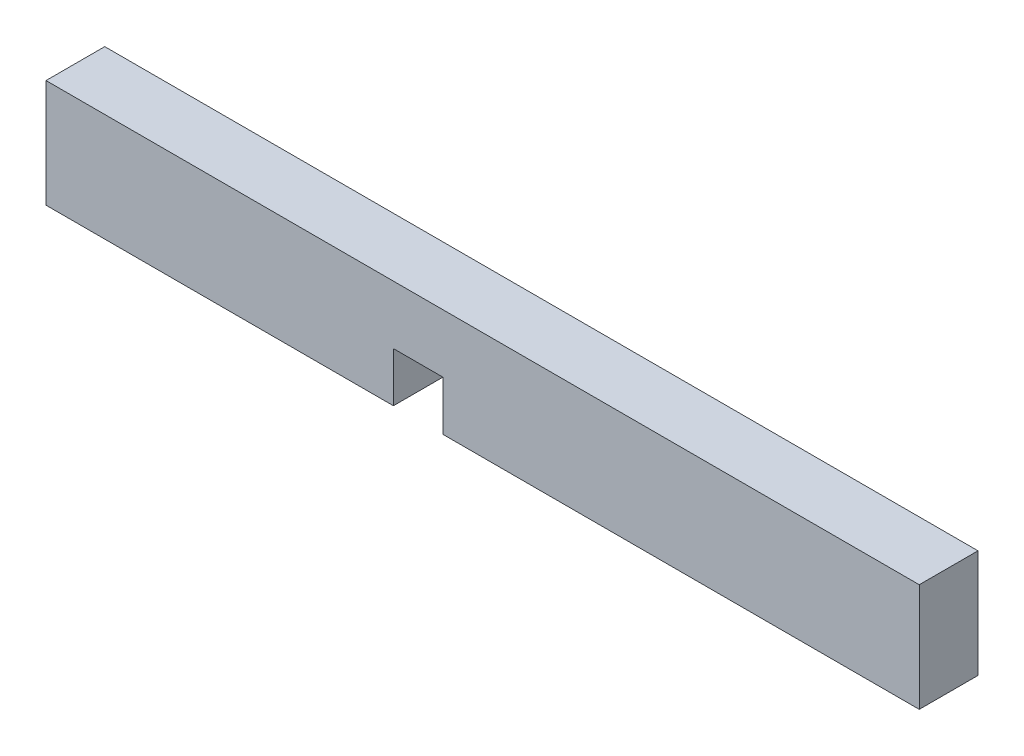
ISO-10303-21;
HEADER;
FILE_DESCRIPTION(('STEP AP214'),'2;1');
FILE_NAME('part.step','',(''),(''),'','','');
FILE_SCHEMA(('AUTOMOTIVE_DESIGN { 1 0 10303 214 1 1 1 1 }'));
ENDSEC;
DATA;
#1=APPLICATION_CONTEXT('core data for automotive mechanical design processes');
#2=APPLICATION_PROTOCOL_DEFINITION('international standard','automotive_design',2000,#1);
#3=PRODUCT_CONTEXT('',#1,'mechanical');
#4=PRODUCT('Part','Part','',(#3));
#5=PRODUCT_RELATED_PRODUCT_CATEGORY('part','',(#4));
#6=PRODUCT_DEFINITION_FORMATION('','',#4);
#7=PRODUCT_DEFINITION_CONTEXT('part definition',#1,'design');
#8=PRODUCT_DEFINITION('design','',#6,#7);
#9=PRODUCT_DEFINITION_SHAPE('','',#8);
#10=(LENGTH_UNIT() NAMED_UNIT(*) SI_UNIT(.MILLI.,.METRE.));
#11=(NAMED_UNIT(*) PLANE_ANGLE_UNIT() SI_UNIT($,.RADIAN.));
#12=(NAMED_UNIT(*) SI_UNIT($,.STERADIAN.) SOLID_ANGLE_UNIT());
#13=UNCERTAINTY_MEASURE_WITH_UNIT(LENGTH_MEASURE(1.E-05),#10,'distance_accuracy_value','');
#14=(GEOMETRIC_REPRESENTATION_CONTEXT(3) GLOBAL_UNCERTAINTY_ASSIGNED_CONTEXT((#13)) GLOBAL_UNIT_ASSIGNED_CONTEXT((#10,
#11,#12)) REPRESENTATION_CONTEXT('',''));
#15=CARTESIAN_POINT('',(0.,0.,0.));
#16=DIRECTION('',(0.,0.,1.));
#17=DIRECTION('',(1.,0.,0.));
#18=AXIS2_PLACEMENT_3D('',#15,#16,#17);
#19=CARTESIAN_POINT('',(-31.75,4.67359999999999,4.699));
#20=DIRECTION('',(1.,0.,0.));
#21=DIRECTION('',(0.,0.,-1.));
#22=AXIS2_PLACEMENT_3D('',#19,#20,#21);
#23=PLANE('',#22);
#24=DIRECTION('',(0.,-1.,0.));
#25=VECTOR('',#24,1.);
#26=CARTESIAN_POINT('',(-31.75,4.67359999999999,0.));
#27=LINE('',#26,#25);
#28=CARTESIAN_POINT('',(-31.75,4.67359999999999,0.));
#29=VERTEX_POINT('',#28);
#30=CARTESIAN_POINT('',(-31.75,-3.96240000000001,0.));
#31=VERTEX_POINT('',#30);
#32=EDGE_CURVE('E137',#29,#31,#27,.T.);
#33=ORIENTED_EDGE('',*,*,#32,.T.);
#34=DIRECTION('',(0.,0.,-1.));
#35=VECTOR('',#34,1.);
#36=CARTESIAN_POINT('',(-31.75,-3.96240000000001,4.699));
#37=LINE('',#36,#35);
#38=CARTESIAN_POINT('',(-31.75,-3.96240000000001,4.699));
#39=VERTEX_POINT('',#38);
#40=EDGE_CURVE('E11',#39,#31,#37,.T.);
#41=ORIENTED_EDGE('',*,*,#40,.F.);
#42=DIRECTION('',(0.,-1.,0.));
#43=VECTOR('',#42,1.);
#44=CARTESIAN_POINT('',(-31.75,4.67359999999999,4.699));
#45=LINE('',#44,#43);
#46=CARTESIAN_POINT('',(-31.75,4.67359999999999,4.699));
#47=VERTEX_POINT('',#46);
#48=EDGE_CURVE('E151',#47,#39,#45,.T.);
#49=ORIENTED_EDGE('',*,*,#48,.F.);
#50=DIRECTION('',(0.,0.,-1.));
#51=VECTOR('',#50,1.);
#52=CARTESIAN_POINT('',(-31.75,4.67359999999999,4.699));
#53=LINE('',#52,#51);
#54=EDGE_CURVE('E133',#47,#29,#53,.T.);
#55=ORIENTED_EDGE('',*,*,#54,.T.);
#56=EDGE_LOOP('',(#33,#41,#49,#55));
#57=FACE_BOUND('',#56,.T.);
#58=ADVANCED_FACE('F41',(#57),#23,.F.);
#59=CARTESIAN_POINT('',(-3.9624,-3.9624,4.699));
#60=DIRECTION('',(0.,1.,0.));
#61=DIRECTION('',(-1.,0.,0.));
#62=AXIS2_PLACEMENT_3D('',#59,#60,#61);
#63=PLANE('',#62);
#64=DIRECTION('',(1.,0.,0.));
#65=VECTOR('',#64,1.);
#66=CARTESIAN_POINT('',(-3.9624,-3.9624,0.));
#67=LINE('',#66,#65);
#68=CARTESIAN_POINT('',(-3.9624,-3.9624,0.));
#69=VERTEX_POINT('',#68);
#70=EDGE_CURVE('E140',#31,#69,#67,.T.);
#71=ORIENTED_EDGE('',*,*,#70,.T.);
#72=DIRECTION('',(0.,0.,-1.));
#73=VECTOR('',#72,1.);
#74=CARTESIAN_POINT('',(-3.9624,-3.9624,4.699));
#75=LINE('',#74,#73);
#76=CARTESIAN_POINT('',(-3.9624,-3.9624,4.699));
#77=VERTEX_POINT('',#76);
#78=EDGE_CURVE('E49',#77,#69,#75,.T.);
#79=ORIENTED_EDGE('',*,*,#78,.F.);
#80=DIRECTION('',(1.,0.,0.));
#81=VECTOR('',#80,1.);
#82=CARTESIAN_POINT('',(-3.9624,-3.9624,4.699));
#83=LINE('',#82,#81);
#84=EDGE_CURVE('E100',#39,#77,#83,.T.);
#85=ORIENTED_EDGE('',*,*,#84,.F.);
#86=ORIENTED_EDGE('',*,*,#40,.T.);
#87=EDGE_LOOP('',(#71,#79,#85,#86));
#88=FACE_BOUND('',#87,.T.);
#89=ADVANCED_FACE('F186',(#88),#63,.F.);
#90=CARTESIAN_POINT('',(-3.9624,-3.9624,4.699));
#91=DIRECTION('',(-1.,0.,0.));
#92=DIRECTION('',(0.,0.,1.));
#93=AXIS2_PLACEMENT_3D('',#90,#91,#92);
#94=PLANE('',#93);
#95=DIRECTION('',(0.,1.,0.));
#96=VECTOR('',#95,1.);
#97=CARTESIAN_POINT('',(-3.9624,-3.9624,0.));
#98=LINE('',#97,#96);
#99=CARTESIAN_POINT('',(-3.9624,0.,0.));
#100=VERTEX_POINT('',#99);
#101=EDGE_CURVE('E142',#69,#100,#98,.T.);
#102=ORIENTED_EDGE('',*,*,#101,.T.);
#103=DIRECTION('',(0.,0.,-1.));
#104=VECTOR('',#103,1.);
#105=CARTESIAN_POINT('',(-3.9624,0.,4.699));
#106=LINE('',#105,#104);
#107=CARTESIAN_POINT('',(-3.9624,0.,4.699));
#108=VERTEX_POINT('',#107);
#109=EDGE_CURVE('E158',#108,#100,#106,.T.);
#110=ORIENTED_EDGE('',*,*,#109,.F.);
#111=DIRECTION('',(0.,1.,0.));
#112=VECTOR('',#111,1.);
#113=CARTESIAN_POINT('',(-3.9624,-3.9624,4.699));
#114=LINE('',#113,#112);
#115=EDGE_CURVE('E166',#77,#108,#114,.T.);
#116=ORIENTED_EDGE('',*,*,#115,.F.);
#117=ORIENTED_EDGE('',*,*,#78,.T.);
#118=EDGE_LOOP('',(#102,#110,#116,#117));
#119=FACE_BOUND('',#118,.T.);
#120=ADVANCED_FACE('F164',(#119),#94,.F.);
#121=CARTESIAN_POINT('',(-3.9624,0.,4.699));
#122=DIRECTION('',(0.,1.,0.));
#123=DIRECTION('',(0.,0.,1.));
#124=AXIS2_PLACEMENT_3D('',#121,#122,#123);
#125=PLANE('',#124);
#126=DIRECTION('',(1.,0.,0.));
#127=VECTOR('',#126,1.);
#128=CARTESIAN_POINT('',(-3.9624,0.,0.));
#129=LINE('',#128,#127);
#130=CARTESIAN_POINT('',(0.,0.,0.));
#131=VERTEX_POINT('',#130);
#132=EDGE_CURVE('E144',#100,#131,#129,.T.);
#133=ORIENTED_EDGE('',*,*,#132,.T.);
#134=DIRECTION('',(0.,0.,-1.));
#135=VECTOR('',#134,1.);
#136=CARTESIAN_POINT('',(0.,0.,4.699));
#137=LINE('',#136,#135);
#138=CARTESIAN_POINT('',(0.,0.,4.699));
#139=VERTEX_POINT('',#138);
#140=EDGE_CURVE('E155',#139,#131,#137,.T.);
#141=ORIENTED_EDGE('',*,*,#140,.F.);
#142=DIRECTION('',(1.,0.,0.));
#143=VECTOR('',#142,1.);
#144=CARTESIAN_POINT('',(-3.9624,0.,4.699));
#145=LINE('',#144,#143);
#146=EDGE_CURVE('E178',#108,#139,#145,.T.);
#147=ORIENTED_EDGE('',*,*,#146,.F.);
#148=ORIENTED_EDGE('',*,*,#109,.T.);
#149=EDGE_LOOP('',(#133,#141,#147,#148));
#150=FACE_BOUND('',#149,.T.);
#151=ADVANCED_FACE('F174',(#150),#125,.F.);
#152=CARTESIAN_POINT('',(0.,-3.9624,4.699));
#153=DIRECTION('',(1.,0.,0.));
#154=DIRECTION('',(0.,0.,-1.));
#155=AXIS2_PLACEMENT_3D('',#152,#153,#154);
#156=PLANE('',#155);
#157=DIRECTION('',(0.,-1.,0.));
#158=VECTOR('',#157,1.);
#159=CARTESIAN_POINT('',(0.,-3.9624,0.));
#160=LINE('',#159,#158);
#161=CARTESIAN_POINT('',(0.,-3.9624,0.));
#162=VERTEX_POINT('',#161);
#163=EDGE_CURVE('E146',#131,#162,#160,.T.);
#164=ORIENTED_EDGE('',*,*,#163,.T.);
#165=DIRECTION('',(0.,0.,-1.));
#166=VECTOR('',#165,1.);
#167=CARTESIAN_POINT('',(0.,-3.9624,4.699));
#168=LINE('',#167,#166);
#169=CARTESIAN_POINT('',(0.,-3.9624,4.699));
#170=VERTEX_POINT('',#169);
#171=EDGE_CURVE('E128',#170,#162,#168,.T.);
#172=ORIENTED_EDGE('',*,*,#171,.F.);
#173=DIRECTION('',(0.,-1.,0.));
#174=VECTOR('',#173,1.);
#175=CARTESIAN_POINT('',(0.,-3.9624,4.699));
#176=LINE('',#175,#174);
#177=EDGE_CURVE('E119',#139,#170,#176,.T.);
#178=ORIENTED_EDGE('',*,*,#177,.F.);
#179=ORIENTED_EDGE('',*,*,#140,.T.);
#180=EDGE_LOOP('',(#164,#172,#178,#179));
#181=FACE_BOUND('',#180,.T.);
#182=ADVANCED_FACE('F177',(#181),#156,.F.);
#183=CARTESIAN_POINT('',(38.1,-3.9624,4.699));
#184=DIRECTION('',(0.,1.,0.));
#185=DIRECTION('',(-1.,0.,0.));
#186=AXIS2_PLACEMENT_3D('',#183,#184,#185);
#187=PLANE('',#186);
#188=DIRECTION('',(1.,0.,0.));
#189=VECTOR('',#188,1.);
#190=CARTESIAN_POINT('',(38.1,-3.9624,0.));
#191=LINE('',#190,#189);
#192=CARTESIAN_POINT('',(38.1,-3.9624,0.));
#193=VERTEX_POINT('',#192);
#194=EDGE_CURVE('E127',#162,#193,#191,.T.);
#195=ORIENTED_EDGE('',*,*,#194,.T.);
#196=DIRECTION('',(0.,0.,-1.));
#197=VECTOR('',#196,1.);
#198=CARTESIAN_POINT('',(38.1,-3.9624,4.699));
#199=LINE('',#198,#197);
#200=CARTESIAN_POINT('',(38.1,-3.9624,4.699));
#201=VERTEX_POINT('',#200);
#202=EDGE_CURVE('E124',#201,#193,#199,.T.);
#203=ORIENTED_EDGE('',*,*,#202,.F.);
#204=DIRECTION('',(1.,0.,0.));
#205=VECTOR('',#204,1.);
#206=CARTESIAN_POINT('',(38.1,-3.9624,4.699));
#207=LINE('',#206,#205);
#208=EDGE_CURVE('E113',#170,#201,#207,.T.);
#209=ORIENTED_EDGE('',*,*,#208,.F.);
#210=ORIENTED_EDGE('',*,*,#171,.T.);
#211=EDGE_LOOP('',(#195,#203,#209,#210));
#212=FACE_BOUND('',#211,.T.);
#213=ADVANCED_FACE('F125',(#212),#187,.F.);
#214=CARTESIAN_POINT('',(38.1,4.6736,4.699));
#215=DIRECTION('',(-1.,0.,0.));
#216=DIRECTION('',(0.,0.,1.));
#217=AXIS2_PLACEMENT_3D('',#214,#215,#216);
#218=PLANE('',#217);
#219=DIRECTION('',(0.,1.,0.));
#220=VECTOR('',#219,1.);
#221=CARTESIAN_POINT('',(38.1,4.6736,0.));
#222=LINE('',#221,#220);
#223=CARTESIAN_POINT('',(38.1,4.6736,0.));
#224=VERTEX_POINT('',#223);
#225=EDGE_CURVE('E86',#193,#224,#222,.T.);
#226=ORIENTED_EDGE('',*,*,#225,.T.);
#227=DIRECTION('',(0.,0.,-1.));
#228=VECTOR('',#227,1.);
#229=CARTESIAN_POINT('',(38.1,4.6736,4.699));
#230=LINE('',#229,#228);
#231=CARTESIAN_POINT('',(38.1,4.6736,4.699));
#232=VERTEX_POINT('',#231);
#233=EDGE_CURVE('E129',#232,#224,#230,.T.);
#234=ORIENTED_EDGE('',*,*,#233,.F.);
#235=DIRECTION('',(0.,1.,0.));
#236=VECTOR('',#235,1.);
#237=CARTESIAN_POINT('',(38.1,4.6736,4.699));
#238=LINE('',#237,#236);
#239=EDGE_CURVE('E117',#201,#232,#238,.T.);
#240=ORIENTED_EDGE('',*,*,#239,.F.);
#241=ORIENTED_EDGE('',*,*,#202,.T.);
#242=EDGE_LOOP('',(#226,#234,#240,#241));
#243=FACE_BOUND('',#242,.T.);
#244=ADVANCED_FACE('F131',(#243),#218,.F.);
#245=CARTESIAN_POINT('',(38.1,4.6736,4.699));
#246=DIRECTION('',(0.,-1.,0.));
#247=DIRECTION('',(1.,0.,0.));
#248=AXIS2_PLACEMENT_3D('',#245,#246,#247);
#249=PLANE('',#248);
#250=DIRECTION('',(-1.,0.,0.));
#251=VECTOR('',#250,1.);
#252=CARTESIAN_POINT('',(38.1,4.6736,0.));
#253=LINE('',#252,#251);
#254=EDGE_CURVE('E92',#224,#29,#253,.T.);
#255=ORIENTED_EDGE('',*,*,#254,.T.);
#256=ORIENTED_EDGE('',*,*,#54,.F.);
#257=DIRECTION('',(-1.,0.,0.));
#258=VECTOR('',#257,1.);
#259=CARTESIAN_POINT('',(38.1,4.6736,4.699));
#260=LINE('',#259,#258);
#261=EDGE_CURVE('E57',#232,#47,#260,.T.);
#262=ORIENTED_EDGE('',*,*,#261,.F.);
#263=ORIENTED_EDGE('',*,*,#233,.T.);
#264=EDGE_LOOP('',(#255,#256,#262,#263));
#265=FACE_BOUND('',#264,.T.);
#266=ADVANCED_FACE('F202',(#265),#249,.F.);
#267=CARTESIAN_POINT('',(0.,0.,4.699));
#268=DIRECTION('',(0.,0.,-1.));
#269=DIRECTION('',(-1.,0.,0.));
#270=AXIS2_PLACEMENT_3D('',#267,#268,#269);
#271=PLANE('',#270);
#272=ORIENTED_EDGE('',*,*,#48,.T.);
#273=ORIENTED_EDGE('',*,*,#84,.T.);
#274=ORIENTED_EDGE('',*,*,#115,.T.);
#275=ORIENTED_EDGE('',*,*,#146,.T.);
#276=ORIENTED_EDGE('',*,*,#177,.T.);
#277=ORIENTED_EDGE('',*,*,#208,.T.);
#278=ORIENTED_EDGE('',*,*,#239,.T.);
#279=ORIENTED_EDGE('',*,*,#261,.T.);
#280=EDGE_LOOP('',(#272,#273,#274,#275,#276,#277,#278,#279));
#281=FACE_BOUND('',#280,.T.);
#282=ADVANCED_FACE('F115',(#281),#271,.F.);
#283=CARTESIAN_POINT('',(0.,0.,0.));
#284=DIRECTION('',(0.,0.,-1.));
#285=DIRECTION('',(-1.,0.,0.));
#286=AXIS2_PLACEMENT_3D('',#283,#284,#285);
#287=PLANE('',#286);
#288=ORIENTED_EDGE('',*,*,#32,.F.);
#289=ORIENTED_EDGE('',*,*,#254,.F.);
#290=ORIENTED_EDGE('',*,*,#225,.F.);
#291=ORIENTED_EDGE('',*,*,#194,.F.);
#292=ORIENTED_EDGE('',*,*,#163,.F.);
#293=ORIENTED_EDGE('',*,*,#132,.F.);
#294=ORIENTED_EDGE('',*,*,#101,.F.);
#295=ORIENTED_EDGE('',*,*,#70,.F.);
#296=EDGE_LOOP('',(#288,#289,#290,#291,#292,#293,#294,#295));
#297=FACE_BOUND('',#296,.T.);
#298=ADVANCED_FACE('F170',(#297),#287,.T.);
#299=CLOSED_SHELL('',(#58,#89,#120,#151,#182,#213,#244,#266,#282,#298));
#300=MANIFOLD_SOLID_BREP('B2',#299);
#301=ADVANCED_BREP_SHAPE_REPRESENTATION('',(#18,#300),#14);
#302=SHAPE_DEFINITION_REPRESENTATION(#9,#301);
ENDSEC;
END-ISO-10303-21;
